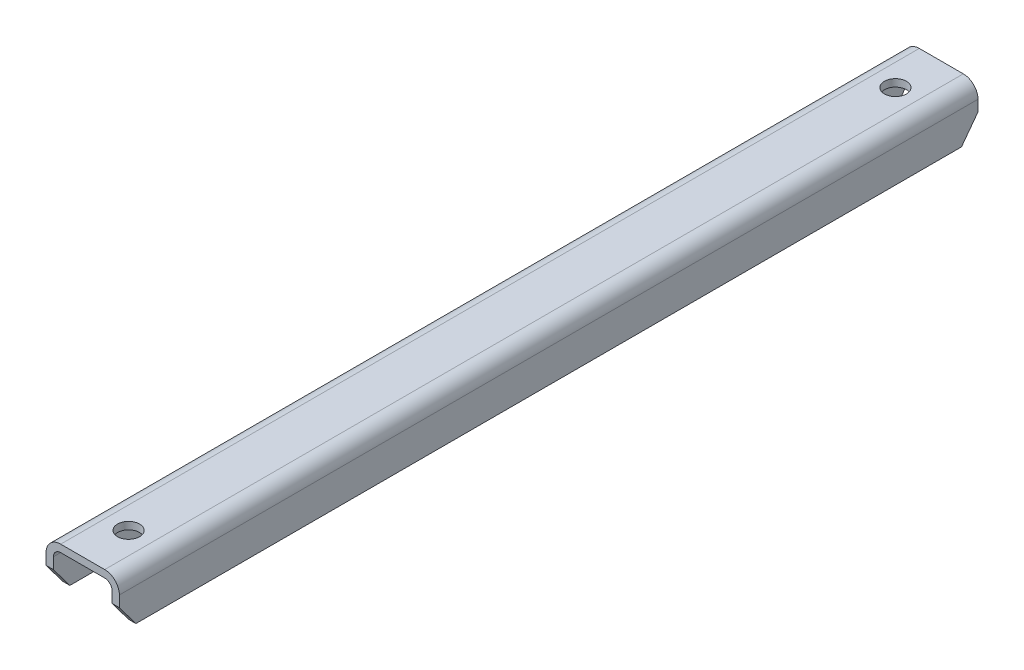
ISO-10303-21;
HEADER;
FILE_DESCRIPTION(('STEP AP214'),'2;1');
FILE_NAME('part.step','',(''),(''),'','','');
FILE_SCHEMA(('AUTOMOTIVE_DESIGN { 1 0 10303 214 1 1 1 1 }'));
ENDSEC;
DATA;
#1=APPLICATION_CONTEXT('core data for automotive mechanical design processes');
#2=APPLICATION_PROTOCOL_DEFINITION('international standard','automotive_design',2000,#1);
#3=PRODUCT_CONTEXT('',#1,'mechanical');
#4=PRODUCT('Part','Part','',(#3));
#5=PRODUCT_RELATED_PRODUCT_CATEGORY('part','',(#4));
#6=PRODUCT_DEFINITION_FORMATION('','',#4);
#7=PRODUCT_DEFINITION_CONTEXT('part definition',#1,'design');
#8=PRODUCT_DEFINITION('design','',#6,#7);
#9=PRODUCT_DEFINITION_SHAPE('','',#8);
#10=(LENGTH_UNIT() NAMED_UNIT(*) SI_UNIT(.MILLI.,.METRE.));
#11=(NAMED_UNIT(*) PLANE_ANGLE_UNIT() SI_UNIT($,.RADIAN.));
#12=(NAMED_UNIT(*) SI_UNIT($,.STERADIAN.) SOLID_ANGLE_UNIT());
#13=UNCERTAINTY_MEASURE_WITH_UNIT(LENGTH_MEASURE(1.E-05),#10,'distance_accuracy_value','');
#14=(GEOMETRIC_REPRESENTATION_CONTEXT(3) GLOBAL_UNCERTAINTY_ASSIGNED_CONTEXT((#13)) GLOBAL_UNIT_ASSIGNED_CONTEXT((#10,
#11,#12)) REPRESENTATION_CONTEXT('',''));
#15=CARTESIAN_POINT('',(0.,0.,0.));
#16=DIRECTION('',(0.,0.,1.));
#17=DIRECTION('',(1.,0.,0.));
#18=AXIS2_PLACEMENT_3D('',#15,#16,#17);
#19=CARTESIAN_POINT('',(-40.,-65.,585.));
#20=DIRECTION('',(0.,1.,0.));
#21=DIRECTION('',(0.,0.,1.));
#22=AXIS2_PLACEMENT_3D('',#19,#20,#21);
#23=PLANE('',#22);
#24=DIRECTION('',(0.,0.,-1.));
#25=VECTOR('',#24,1.);
#26=CARTESIAN_POINT('',(-50.,-65.,585.));
#27=LINE('',#26,#25);
#28=CARTESIAN_POINT('',(-50.,-65.,562.5));
#29=VERTEX_POINT('',#28);
#30=CARTESIAN_POINT('',(-50.,-64.9999999999999,-562.5));
#31=VERTEX_POINT('',#30);
#32=EDGE_CURVE('E196',#29,#31,#27,.T.);
#33=ORIENTED_EDGE('',*,*,#32,.T.);
#34=DIRECTION('',(1.,0.,0.));
#35=VECTOR('',#34,1.);
#36=CARTESIAN_POINT('',(-350.,-64.9999999999999,-562.5));
#37=LINE('',#36,#35);
#38=CARTESIAN_POINT('',(-40.,-64.9999999999999,-562.5));
#39=VERTEX_POINT('',#38);
#40=EDGE_CURVE('E301',#31,#39,#37,.T.);
#41=ORIENTED_EDGE('',*,*,#40,.T.);
#42=DIRECTION('',(0.,0.,-1.));
#43=VECTOR('',#42,1.);
#44=CARTESIAN_POINT('',(-40.,-65.,585.));
#45=LINE('',#44,#43);
#46=CARTESIAN_POINT('',(-40.,-65.,562.5));
#47=VERTEX_POINT('',#46);
#48=EDGE_CURVE('E161',#47,#39,#45,.T.);
#49=ORIENTED_EDGE('',*,*,#48,.F.);
#50=DIRECTION('',(1.,0.,0.));
#51=VECTOR('',#50,1.);
#52=CARTESIAN_POINT('',(-350.,-65.,562.5));
#53=LINE('',#52,#51);
#54=EDGE_CURVE('E273',#29,#47,#53,.T.);
#55=ORIENTED_EDGE('',*,*,#54,.F.);
#56=EDGE_LOOP('',(#33,#41,#49,#55));
#57=FACE_BOUND('',#56,.T.);
#58=ADVANCED_FACE('F36',(#57),#23,.F.);
#59=CARTESIAN_POINT('',(-40.,-20.0000000000001,585.));
#60=DIRECTION('',(-1.,0.,0.));
#61=DIRECTION('',(0.,0.,1.));
#62=AXIS2_PLACEMENT_3D('',#59,#60,#61);
#63=PLANE('',#62);
#64=ORIENTED_EDGE('',*,*,#48,.T.);
#65=DIRECTION('',(0.,0.800000000000001,-0.599999999999999));
#66=VECTOR('',#65,1.);
#67=CARTESIAN_POINT('',(-40.,-587.,-171.000000000001));
#68=LINE('',#67,#66);
#69=CARTESIAN_POINT('',(-40.,-34.9999999999999,-585.));
#70=VERTEX_POINT('',#69);
#71=EDGE_CURVE('E146',#39,#70,#68,.T.);
#72=ORIENTED_EDGE('',*,*,#71,.T.);
#73=DIRECTION('',(0.,1.,0.));
#74=VECTOR('',#73,1.);
#75=CARTESIAN_POINT('',(-40.,-20.0000000000001,-585.));
#76=LINE('',#75,#74);
#77=CARTESIAN_POINT('',(-40.,-20.0000000000001,-585.));
#78=VERTEX_POINT('',#77);
#79=EDGE_CURVE('E157',#70,#78,#76,.T.);
#80=ORIENTED_EDGE('',*,*,#79,.T.);
#81=DIRECTION('',(0.,0.,-1.));
#82=VECTOR('',#81,1.);
#83=CARTESIAN_POINT('',(-40.,-20.0000000000001,585.));
#84=LINE('',#83,#82);
#85=CARTESIAN_POINT('',(-40.,-20.0000000000001,585.));
#86=VERTEX_POINT('',#85);
#87=EDGE_CURVE('E226',#86,#78,#84,.T.);
#88=ORIENTED_EDGE('',*,*,#87,.F.);
#89=DIRECTION('',(0.,1.,0.));
#90=VECTOR('',#89,1.);
#91=CARTESIAN_POINT('',(-40.,-20.0000000000001,585.));
#92=LINE('',#91,#90);
#93=CARTESIAN_POINT('',(-40.,-35.,585.));
#94=VERTEX_POINT('',#93);
#95=EDGE_CURVE('E195',#94,#86,#92,.T.);
#96=ORIENTED_EDGE('',*,*,#95,.F.);
#97=DIRECTION('',(0.,-0.800000000000001,-0.6));
#98=VECTOR('',#97,1.);
#99=CARTESIAN_POINT('',(-40.,-25.4000000000001,592.2));
#100=LINE('',#99,#98);
#101=EDGE_CURVE('E169',#94,#47,#100,.T.);
#102=ORIENTED_EDGE('',*,*,#101,.T.);
#103=EDGE_LOOP('',(#64,#72,#80,#88,#96,#102));
#104=FACE_BOUND('',#103,.T.);
#105=ADVANCED_FACE('F155',(#104),#63,.F.);
#106=CARTESIAN_POINT('',(-30.,-20.,585.));
#107=DIRECTION('',(0.,0.,-1.));
#108=DIRECTION('',(-1.,0.,0.));
#109=AXIS2_PLACEMENT_3D('',#106,#107,#108);
#110=CYLINDRICAL_SURFACE('',#109,9.99999999999999);
#111=CARTESIAN_POINT('',(-30.,-20.,-585.));
#112=DIRECTION('',(0.,0.,-1.));
#113=DIRECTION('',(1.,0.,0.));
#114=AXIS2_PLACEMENT_3D('',#111,#112,#113);
#115=CIRCLE('',#114,9.99999999999999);
#116=CARTESIAN_POINT('',(-29.9999999999999,-10.,-585.));
#117=VERTEX_POINT('',#116);
#118=EDGE_CURVE('E168',#78,#117,#115,.T.);
#119=ORIENTED_EDGE('',*,*,#118,.T.);
#120=DIRECTION('',(0.,0.,-1.));
#121=VECTOR('',#120,1.);
#122=CARTESIAN_POINT('',(-29.9999999999999,-10.,585.));
#123=LINE('',#122,#121);
#124=CARTESIAN_POINT('',(-29.9999999999999,-10.,585.));
#125=VERTEX_POINT('',#124);
#126=EDGE_CURVE('E223',#125,#117,#123,.T.);
#127=ORIENTED_EDGE('',*,*,#126,.F.);
#128=CARTESIAN_POINT('',(-30.,-20.,585.));
#129=DIRECTION('',(0.,0.,-1.));
#130=DIRECTION('',(1.,0.,0.));
#131=AXIS2_PLACEMENT_3D('',#128,#129,#130);
#132=CIRCLE('',#131,9.99999999999999);
#133=EDGE_CURVE('E279',#86,#125,#132,.T.);
#134=ORIENTED_EDGE('',*,*,#133,.F.);
#135=ORIENTED_EDGE('',*,*,#87,.T.);
#136=EDGE_LOOP('',(#119,#127,#134,#135));
#137=FACE_BOUND('',#136,.T.);
#138=ADVANCED_FACE('F339',(#137),#110,.F.);
#139=CARTESIAN_POINT('',(-29.9999999999999,-10.,585.));
#140=DIRECTION('',(0.,1.,0.));
#141=DIRECTION('',(0.,0.,1.));
#142=AXIS2_PLACEMENT_3D('',#139,#140,#141);
#143=PLANE('',#142);
#144=CARTESIAN_POINT('',(0.,-10.,522.5));
#145=DIRECTION('',(0.,1.,0.));
#146=DIRECTION('',(0.,0.,1.));
#147=AXIS2_PLACEMENT_3D('',#144,#145,#146);
#148=CIRCLE('',#147,15.);
#149=CARTESIAN_POINT('',(0.,-10.,537.5));
#150=VERTEX_POINT('',#149);
#151=EDGE_CURVE('E312',#150,#150,#148,.T.);
#152=ORIENTED_EDGE('',*,*,#151,.T.);
#153=EDGE_LOOP('',(#152));
#154=FACE_BOUND('',#153,.T.);
#155=CARTESIAN_POINT('',(0.,-10.,-522.5));
#156=DIRECTION('',(0.,1.,0.));
#157=DIRECTION('',(0.,0.,1.));
#158=AXIS2_PLACEMENT_3D('',#155,#156,#157);
#159=CIRCLE('',#158,15.);
#160=CARTESIAN_POINT('',(0.,-10.,-507.5));
#161=VERTEX_POINT('',#160);
#162=EDGE_CURVE('E306',#161,#161,#159,.T.);
#163=ORIENTED_EDGE('',*,*,#162,.T.);
#164=EDGE_LOOP('',(#163));
#165=FACE_BOUND('',#164,.T.);
#166=DIRECTION('',(1.,0.,0.));
#167=VECTOR('',#166,1.);
#168=CARTESIAN_POINT('',(-29.9999999999999,-10.,-585.));
#169=LINE('',#168,#167);
#170=CARTESIAN_POINT('',(29.9999999999999,-10.,-585.));
#171=VERTEX_POINT('',#170);
#172=EDGE_CURVE('E171',#117,#171,#169,.T.);
#173=ORIENTED_EDGE('',*,*,#172,.T.);
#174=DIRECTION('',(0.,0.,-1.));
#175=VECTOR('',#174,1.);
#176=CARTESIAN_POINT('',(29.9999999999999,-10.,585.));
#177=LINE('',#176,#175);
#178=CARTESIAN_POINT('',(29.9999999999999,-10.,585.));
#179=VERTEX_POINT('',#178);
#180=EDGE_CURVE('E220',#179,#171,#177,.T.);
#181=ORIENTED_EDGE('',*,*,#180,.F.);
#182=DIRECTION('',(1.,0.,0.));
#183=VECTOR('',#182,1.);
#184=CARTESIAN_POINT('',(-29.9999999999999,-10.,585.));
#185=LINE('',#184,#183);
#186=EDGE_CURVE('E256',#125,#179,#185,.T.);
#187=ORIENTED_EDGE('',*,*,#186,.F.);
#188=ORIENTED_EDGE('',*,*,#126,.T.);
#189=EDGE_LOOP('',(#173,#181,#187,#188));
#190=FACE_BOUND('',#189,.T.);
#191=ADVANCED_FACE('F285',(#154,#165,#190),#143,.F.);
#192=CARTESIAN_POINT('',(30.,-20.,585.));
#193=DIRECTION('',(0.,0.,-1.));
#194=DIRECTION('',(-1.,0.,0.));
#195=AXIS2_PLACEMENT_3D('',#192,#193,#194);
#196=CYLINDRICAL_SURFACE('',#195,10.);
#197=CARTESIAN_POINT('',(30.,-20.,-585.));
#198=DIRECTION('',(0.,0.,-1.));
#199=DIRECTION('',(-1.,0.,0.));
#200=AXIS2_PLACEMENT_3D('',#197,#198,#199);
#201=CIRCLE('',#200,10.);
#202=CARTESIAN_POINT('',(40.,-20.0000000000001,-585.));
#203=VERTEX_POINT('',#202);
#204=EDGE_CURVE('E180',#171,#203,#201,.T.);
#205=ORIENTED_EDGE('',*,*,#204,.T.);
#206=DIRECTION('',(0.,0.,-1.));
#207=VECTOR('',#206,1.);
#208=CARTESIAN_POINT('',(40.,-20.0000000000001,585.));
#209=LINE('',#208,#207);
#210=CARTESIAN_POINT('',(40.,-20.0000000000001,585.));
#211=VERTEX_POINT('',#210);
#212=EDGE_CURVE('E217',#211,#203,#209,.T.);
#213=ORIENTED_EDGE('',*,*,#212,.F.);
#214=CARTESIAN_POINT('',(30.,-20.,585.));
#215=DIRECTION('',(0.,0.,-1.));
#216=DIRECTION('',(-1.,0.,0.));
#217=AXIS2_PLACEMENT_3D('',#214,#215,#216);
#218=CIRCLE('',#217,10.);
#219=EDGE_CURVE('E250',#179,#211,#218,.T.);
#220=ORIENTED_EDGE('',*,*,#219,.F.);
#221=ORIENTED_EDGE('',*,*,#180,.T.);
#222=EDGE_LOOP('',(#205,#213,#220,#221));
#223=FACE_BOUND('',#222,.T.);
#224=ADVANCED_FACE('F288',(#223),#196,.F.);
#225=CARTESIAN_POINT('',(40.,-20.0000000000001,585.));
#226=DIRECTION('',(1.,0.,0.));
#227=DIRECTION('',(0.,0.,-1.));
#228=AXIS2_PLACEMENT_3D('',#225,#226,#227);
#229=PLANE('',#228);
#230=DIRECTION('',(0.,-1.,0.));
#231=VECTOR('',#230,1.);
#232=CARTESIAN_POINT('',(40.,-20.0000000000001,-585.));
#233=LINE('',#232,#231);
#234=CARTESIAN_POINT('',(40.,-34.9999999999999,-585.));
#235=VERTEX_POINT('',#234);
#236=EDGE_CURVE('E182',#203,#235,#233,.T.);
#237=ORIENTED_EDGE('',*,*,#236,.T.);
#238=DIRECTION('',(0.,-0.800000000000001,0.599999999999999));
#239=VECTOR('',#238,1.);
#240=CARTESIAN_POINT('',(40.,-587.,-171.000000000001));
#241=LINE('',#240,#239);
#242=CARTESIAN_POINT('',(40.,-64.9999999999999,-562.5));
#243=VERTEX_POINT('',#242);
#244=EDGE_CURVE('E50',#235,#243,#241,.T.);
#245=ORIENTED_EDGE('',*,*,#244,.T.);
#246=DIRECTION('',(0.,0.,-1.));
#247=VECTOR('',#246,1.);
#248=CARTESIAN_POINT('',(40.,-65.,585.));
#249=LINE('',#248,#247);
#250=CARTESIAN_POINT('',(40.,-65.,562.5));
#251=VERTEX_POINT('',#250);
#252=EDGE_CURVE('E214',#251,#243,#249,.T.);
#253=ORIENTED_EDGE('',*,*,#252,.F.);
#254=DIRECTION('',(0.,0.800000000000001,0.6));
#255=VECTOR('',#254,1.);
#256=CARTESIAN_POINT('',(40.,-25.4,592.2));
#257=LINE('',#256,#255);
#258=CARTESIAN_POINT('',(40.,-35.,585.));
#259=VERTEX_POINT('',#258);
#260=EDGE_CURVE('E173',#251,#259,#257,.T.);
#261=ORIENTED_EDGE('',*,*,#260,.T.);
#262=DIRECTION('',(0.,-1.,0.));
#263=VECTOR('',#262,1.);
#264=CARTESIAN_POINT('',(40.,-20.0000000000001,585.));
#265=LINE('',#264,#263);
#266=EDGE_CURVE('E246',#211,#259,#265,.T.);
#267=ORIENTED_EDGE('',*,*,#266,.F.);
#268=ORIENTED_EDGE('',*,*,#212,.T.);
#269=EDGE_LOOP('',(#237,#245,#253,#261,#267,#268));
#270=FACE_BOUND('',#269,.T.);
#271=ADVANCED_FACE('F245',(#270),#229,.F.);
#272=CARTESIAN_POINT('',(40.,-65.,585.));
#273=DIRECTION('',(0.,1.,0.));
#274=DIRECTION('',(0.,0.,1.));
#275=AXIS2_PLACEMENT_3D('',#272,#273,#274);
#276=PLANE('',#275);
#277=ORIENTED_EDGE('',*,*,#252,.T.);
#278=CARTESIAN_POINT('',(50.,-64.9999999999999,-562.5));
#279=VERTEX_POINT('',#278);
#280=EDGE_CURVE('E304',#243,#279,#37,.T.);
#281=ORIENTED_EDGE('',*,*,#280,.T.);
#282=DIRECTION('',(0.,0.,-1.));
#283=VECTOR('',#282,1.);
#284=CARTESIAN_POINT('',(50.,-65.,585.));
#285=LINE('',#284,#283);
#286=CARTESIAN_POINT('',(50.,-65.,562.5));
#287=VERTEX_POINT('',#286);
#288=EDGE_CURVE('E211',#287,#279,#285,.T.);
#289=ORIENTED_EDGE('',*,*,#288,.F.);
#290=EDGE_CURVE('E162',#251,#287,#53,.T.);
#291=ORIENTED_EDGE('',*,*,#290,.F.);
#292=EDGE_LOOP('',(#277,#281,#289,#291));
#293=FACE_BOUND('',#292,.T.);
#294=ADVANCED_FACE('F368',(#293),#276,.F.);
#295=CARTESIAN_POINT('',(50.,-20.0000000000001,585.));
#296=DIRECTION('',(-1.,0.,0.));
#297=DIRECTION('',(0.,-1.,0.));
#298=AXIS2_PLACEMENT_3D('',#295,#296,#297);
#299=PLANE('',#298);
#300=ORIENTED_EDGE('',*,*,#288,.T.);
#301=DIRECTION('',(0.,0.800000000000001,-0.599999999999999));
#302=VECTOR('',#301,1.);
#303=CARTESIAN_POINT('',(49.9999999999999,-587.,-171.000000000001));
#304=LINE('',#303,#302);
#305=CARTESIAN_POINT('',(50.,-34.9999999999999,-585.));
#306=VERTEX_POINT('',#305);
#307=EDGE_CURVE('E293',#279,#306,#304,.T.);
#308=ORIENTED_EDGE('',*,*,#307,.T.);
#309=DIRECTION('',(0.,1.,0.));
#310=VECTOR('',#309,1.);
#311=CARTESIAN_POINT('',(50.,-20.0000000000001,-585.));
#312=LINE('',#311,#310);
#313=CARTESIAN_POINT('',(50.,-20.0000000000001,-585.));
#314=VERTEX_POINT('',#313);
#315=EDGE_CURVE('E185',#306,#314,#312,.T.);
#316=ORIENTED_EDGE('',*,*,#315,.T.);
#317=DIRECTION('',(0.,0.,-1.));
#318=VECTOR('',#317,1.);
#319=CARTESIAN_POINT('',(50.,-20.0000000000001,585.));
#320=LINE('',#319,#318);
#321=CARTESIAN_POINT('',(50.,-20.0000000000001,585.));
#322=VERTEX_POINT('',#321);
#323=EDGE_CURVE('E208',#322,#314,#320,.T.);
#324=ORIENTED_EDGE('',*,*,#323,.F.);
#325=DIRECTION('',(0.,1.,0.));
#326=VECTOR('',#325,1.);
#327=CARTESIAN_POINT('',(50.,-20.0000000000001,585.));
#328=LINE('',#327,#326);
#329=CARTESIAN_POINT('',(50.,-35.,585.));
#330=VERTEX_POINT('',#329);
#331=EDGE_CURVE('E252',#330,#322,#328,.T.);
#332=ORIENTED_EDGE('',*,*,#331,.F.);
#333=DIRECTION('',(0.,-0.800000000000001,-0.6));
#334=VECTOR('',#333,1.);
#335=CARTESIAN_POINT('',(50.,-25.4000000000001,592.2));
#336=LINE('',#335,#334);
#337=EDGE_CURVE('E238',#330,#287,#336,.T.);
#338=ORIENTED_EDGE('',*,*,#337,.T.);
#339=EDGE_LOOP('',(#300,#308,#316,#324,#332,#338));
#340=FACE_BOUND('',#339,.T.);
#341=ADVANCED_FACE('F296',(#340),#299,.F.);
#342=CARTESIAN_POINT('',(30.,-20.,585.));
#343=DIRECTION('',(0.,0.,-1.));
#344=DIRECTION('',(-1.,0.,0.));
#345=AXIS2_PLACEMENT_3D('',#342,#343,#344);
#346=CYLINDRICAL_SURFACE('',#345,20.);
#347=CARTESIAN_POINT('',(30.,-20.,-585.));
#348=DIRECTION('',(0.,0.,1.));
#349=DIRECTION('',(-1.,0.,0.));
#350=AXIS2_PLACEMENT_3D('',#347,#348,#349);
#351=CIRCLE('',#350,20.);
#352=CARTESIAN_POINT('',(29.9999999999999,0.,-585.));
#353=VERTEX_POINT('',#352);
#354=EDGE_CURVE('E187',#314,#353,#351,.T.);
#355=ORIENTED_EDGE('',*,*,#354,.T.);
#356=DIRECTION('',(0.,0.,-1.));
#357=VECTOR('',#356,1.);
#358=CARTESIAN_POINT('',(29.9999999999999,0.,585.));
#359=LINE('',#358,#357);
#360=CARTESIAN_POINT('',(29.9999999999999,0.,585.));
#361=VERTEX_POINT('',#360);
#362=EDGE_CURVE('E205',#361,#353,#359,.T.);
#363=ORIENTED_EDGE('',*,*,#362,.F.);
#364=CARTESIAN_POINT('',(30.,-20.,585.));
#365=DIRECTION('',(0.,0.,1.));
#366=DIRECTION('',(-1.,0.,0.));
#367=AXIS2_PLACEMENT_3D('',#364,#365,#366);
#368=CIRCLE('',#367,20.);
#369=EDGE_CURVE('E254',#322,#361,#368,.T.);
#370=ORIENTED_EDGE('',*,*,#369,.F.);
#371=ORIENTED_EDGE('',*,*,#323,.T.);
#372=EDGE_LOOP('',(#355,#363,#370,#371));
#373=FACE_BOUND('',#372,.T.);
#374=ADVANCED_FACE('F326',(#373),#346,.T.);
#375=CARTESIAN_POINT('',(-29.9999999999999,0.,585.));
#376=DIRECTION('',(0.,-1.,0.));
#377=DIRECTION('',(0.,0.,-1.));
#378=AXIS2_PLACEMENT_3D('',#375,#376,#377);
#379=PLANE('',#378);
#380=CARTESIAN_POINT('',(0.,0.,522.5));
#381=DIRECTION('',(0.,1.,0.));
#382=DIRECTION('',(0.,0.,1.));
#383=AXIS2_PLACEMENT_3D('',#380,#381,#382);
#384=CIRCLE('',#383,15.);
#385=CARTESIAN_POINT('',(0.,0.,537.5));
#386=VERTEX_POINT('',#385);
#387=EDGE_CURVE('E315',#386,#386,#384,.T.);
#388=ORIENTED_EDGE('',*,*,#387,.F.);
#389=EDGE_LOOP('',(#388));
#390=FACE_BOUND('',#389,.T.);
#391=CARTESIAN_POINT('',(0.,0.,-522.5));
#392=DIRECTION('',(0.,1.,0.));
#393=DIRECTION('',(0.,0.,1.));
#394=AXIS2_PLACEMENT_3D('',#391,#392,#393);
#395=CIRCLE('',#394,15.);
#396=CARTESIAN_POINT('',(0.,0.,-507.5));
#397=VERTEX_POINT('',#396);
#398=EDGE_CURVE('E309',#397,#397,#395,.T.);
#399=ORIENTED_EDGE('',*,*,#398,.F.);
#400=EDGE_LOOP('',(#399));
#401=FACE_BOUND('',#400,.T.);
#402=DIRECTION('',(-1.,0.,0.));
#403=VECTOR('',#402,1.);
#404=CARTESIAN_POINT('',(-29.9999999999999,0.,-585.));
#405=LINE('',#404,#403);
#406=CARTESIAN_POINT('',(-29.9999999999999,0.,-585.));
#407=VERTEX_POINT('',#406);
#408=EDGE_CURVE('E189',#353,#407,#405,.T.);
#409=ORIENTED_EDGE('',*,*,#408,.T.);
#410=DIRECTION('',(0.,0.,-1.));
#411=VECTOR('',#410,1.);
#412=CARTESIAN_POINT('',(-29.9999999999999,0.,585.));
#413=LINE('',#412,#411);
#414=CARTESIAN_POINT('',(-29.9999999999999,0.,585.));
#415=VERTEX_POINT('',#414);
#416=EDGE_CURVE('E202',#415,#407,#413,.T.);
#417=ORIENTED_EDGE('',*,*,#416,.F.);
#418=DIRECTION('',(-1.,0.,0.));
#419=VECTOR('',#418,1.);
#420=CARTESIAN_POINT('',(-29.9999999999999,0.,585.));
#421=LINE('',#420,#419);
#422=EDGE_CURVE('E261',#361,#415,#421,.T.);
#423=ORIENTED_EDGE('',*,*,#422,.F.);
#424=ORIENTED_EDGE('',*,*,#362,.T.);
#425=EDGE_LOOP('',(#409,#417,#423,#424));
#426=FACE_BOUND('',#425,.T.);
#427=ADVANCED_FACE('F322',(#390,#401,#426),#379,.F.);
#428=CARTESIAN_POINT('',(-30.,-20.,585.));
#429=DIRECTION('',(0.,0.,-1.));
#430=DIRECTION('',(-1.,0.,0.));
#431=AXIS2_PLACEMENT_3D('',#428,#429,#430);
#432=CYLINDRICAL_SURFACE('',#431,20.);
#433=CARTESIAN_POINT('',(-30.,-20.,-585.));
#434=DIRECTION('',(0.,0.,1.));
#435=DIRECTION('',(1.,0.,0.));
#436=AXIS2_PLACEMENT_3D('',#433,#434,#435);
#437=CIRCLE('',#436,20.);
#438=CARTESIAN_POINT('',(-50.,-20.0000000000001,-585.));
#439=VERTEX_POINT('',#438);
#440=EDGE_CURVE('E191',#407,#439,#437,.T.);
#441=ORIENTED_EDGE('',*,*,#440,.T.);
#442=DIRECTION('',(0.,0.,-1.));
#443=VECTOR('',#442,1.);
#444=CARTESIAN_POINT('',(-50.,-20.0000000000001,585.));
#445=LINE('',#444,#443);
#446=CARTESIAN_POINT('',(-50.,-20.0000000000001,585.));
#447=VERTEX_POINT('',#446);
#448=EDGE_CURVE('E199',#447,#439,#445,.T.);
#449=ORIENTED_EDGE('',*,*,#448,.F.);
#450=CARTESIAN_POINT('',(-30.,-20.,585.));
#451=DIRECTION('',(0.,0.,1.));
#452=DIRECTION('',(1.,0.,0.));
#453=AXIS2_PLACEMENT_3D('',#450,#451,#452);
#454=CIRCLE('',#453,20.);
#455=EDGE_CURVE('E262',#415,#447,#454,.T.);
#456=ORIENTED_EDGE('',*,*,#455,.F.);
#457=ORIENTED_EDGE('',*,*,#416,.T.);
#458=EDGE_LOOP('',(#441,#449,#456,#457));
#459=FACE_BOUND('',#458,.T.);
#460=ADVANCED_FACE('F325',(#459),#432,.T.);
#461=CARTESIAN_POINT('',(-50.,-20.0000000000001,585.));
#462=DIRECTION('',(1.,0.,0.));
#463=DIRECTION('',(0.,1.,0.));
#464=AXIS2_PLACEMENT_3D('',#461,#462,#463);
#465=PLANE('',#464);
#466=DIRECTION('',(0.,-1.,0.));
#467=VECTOR('',#466,1.);
#468=CARTESIAN_POINT('',(-50.,-20.0000000000001,-585.));
#469=LINE('',#468,#467);
#470=CARTESIAN_POINT('',(-50.,-34.9999999999999,-585.));
#471=VERTEX_POINT('',#470);
#472=EDGE_CURVE('E193',#439,#471,#469,.T.);
#473=ORIENTED_EDGE('',*,*,#472,.T.);
#474=DIRECTION('',(0.,-0.800000000000001,0.599999999999999));
#475=VECTOR('',#474,1.);
#476=CARTESIAN_POINT('',(-49.9999999999999,-587.,-171.000000000001));
#477=LINE('',#476,#475);
#478=EDGE_CURVE('E57',#471,#31,#477,.T.);
#479=ORIENTED_EDGE('',*,*,#478,.T.);
#480=ORIENTED_EDGE('',*,*,#32,.F.);
#481=DIRECTION('',(0.,0.800000000000001,0.6));
#482=VECTOR('',#481,1.);
#483=CARTESIAN_POINT('',(-50.,-25.4000000000001,592.2));
#484=LINE('',#483,#482);
#485=CARTESIAN_POINT('',(-50.,-35.,585.));
#486=VERTEX_POINT('',#485);
#487=EDGE_CURVE('E271',#29,#486,#484,.T.);
#488=ORIENTED_EDGE('',*,*,#487,.T.);
#489=DIRECTION('',(0.,-1.,0.));
#490=VECTOR('',#489,1.);
#491=CARTESIAN_POINT('',(-50.,-20.0000000000001,585.));
#492=LINE('',#491,#490);
#493=EDGE_CURVE('E176',#447,#486,#492,.T.);
#494=ORIENTED_EDGE('',*,*,#493,.F.);
#495=ORIENTED_EDGE('',*,*,#448,.T.);
#496=EDGE_LOOP('',(#473,#479,#480,#488,#494,#495));
#497=FACE_BOUND('',#496,.T.);
#498=ADVANCED_FACE('F269',(#497),#465,.F.);
#499=CARTESIAN_POINT('',(-30.,-20.,585.));
#500=DIRECTION('',(0.,0.,1.));
#501=DIRECTION('',(1.,0.,0.));
#502=AXIS2_PLACEMENT_3D('',#499,#500,#501);
#503=PLANE('',#502);
#504=DIRECTION('',(-1.,0.,0.));
#505=VECTOR('',#504,1.);
#506=CARTESIAN_POINT('',(-30.,-35.,585.));
#507=LINE('',#506,#505);
#508=EDGE_CURVE('E152',#330,#259,#507,.T.);
#509=ORIENTED_EDGE('',*,*,#508,.F.);
#510=ORIENTED_EDGE('',*,*,#331,.T.);
#511=ORIENTED_EDGE('',*,*,#369,.T.);
#512=ORIENTED_EDGE('',*,*,#422,.T.);
#513=ORIENTED_EDGE('',*,*,#455,.T.);
#514=ORIENTED_EDGE('',*,*,#493,.T.);
#515=EDGE_CURVE('E228',#94,#486,#507,.T.);
#516=ORIENTED_EDGE('',*,*,#515,.F.);
#517=ORIENTED_EDGE('',*,*,#95,.T.);
#518=ORIENTED_EDGE('',*,*,#133,.T.);
#519=ORIENTED_EDGE('',*,*,#186,.T.);
#520=ORIENTED_EDGE('',*,*,#219,.T.);
#521=ORIENTED_EDGE('',*,*,#266,.T.);
#522=EDGE_LOOP('',(#509,#510,#511,#512,#513,#514,#516,#517,#518,#519,#520,#521));
#523=FACE_BOUND('',#522,.T.);
#524=ADVANCED_FACE('F248',(#523),#503,.T.);
#525=CARTESIAN_POINT('',(-30.,-20.,-585.));
#526=DIRECTION('',(0.,0.,1.));
#527=DIRECTION('',(1.,0.,0.));
#528=AXIS2_PLACEMENT_3D('',#525,#526,#527);
#529=PLANE('',#528);
#530=ORIENTED_EDGE('',*,*,#315,.F.);
#531=DIRECTION('',(-1.,0.,0.));
#532=VECTOR('',#531,1.);
#533=CARTESIAN_POINT('',(-30.,-34.9999999999999,-585.));
#534=LINE('',#533,#532);
#535=EDGE_CURVE('E11',#306,#235,#534,.T.);
#536=ORIENTED_EDGE('',*,*,#535,.T.);
#537=ORIENTED_EDGE('',*,*,#236,.F.);
#538=ORIENTED_EDGE('',*,*,#204,.F.);
#539=ORIENTED_EDGE('',*,*,#172,.F.);
#540=ORIENTED_EDGE('',*,*,#118,.F.);
#541=ORIENTED_EDGE('',*,*,#79,.F.);
#542=EDGE_CURVE('E39',#70,#471,#534,.T.);
#543=ORIENTED_EDGE('',*,*,#542,.T.);
#544=ORIENTED_EDGE('',*,*,#472,.F.);
#545=ORIENTED_EDGE('',*,*,#440,.F.);
#546=ORIENTED_EDGE('',*,*,#408,.F.);
#547=ORIENTED_EDGE('',*,*,#354,.F.);
#548=EDGE_LOOP('',(#530,#536,#537,#538,#539,#540,#541,#543,#544,#545,#546,#547));
#549=FACE_BOUND('',#548,.T.);
#550=ADVANCED_FACE('F166',(#549),#529,.F.);
#551=CARTESIAN_POINT('',(-350.,-65.,562.5));
#552=DIRECTION('',(0.,0.599999999999999,-0.8));
#553=DIRECTION('',(0.,0.800000000000001,0.6));
#554=AXIS2_PLACEMENT_3D('',#551,#552,#553);
#555=PLANE('',#554);
#556=ORIENTED_EDGE('',*,*,#515,.T.);
#557=ORIENTED_EDGE('',*,*,#487,.F.);
#558=ORIENTED_EDGE('',*,*,#54,.T.);
#559=ORIENTED_EDGE('',*,*,#101,.F.);
#560=EDGE_LOOP('',(#556,#557,#558,#559));
#561=FACE_BOUND('',#560,.T.);
#562=ADVANCED_FACE('F337',(#561),#555,.F.);
#563=ORIENTED_EDGE('',*,*,#290,.T.);
#564=ORIENTED_EDGE('',*,*,#337,.F.);
#565=ORIENTED_EDGE('',*,*,#508,.T.);
#566=ORIENTED_EDGE('',*,*,#260,.F.);
#567=EDGE_LOOP('',(#563,#564,#565,#566));
#568=FACE_BOUND('',#567,.T.);
#569=ADVANCED_FACE('F235',(#568),#555,.F.);
#570=CARTESIAN_POINT('',(-350.,-64.9999999999999,-562.5));
#571=DIRECTION('',(0.,0.599999999999999,0.8));
#572=DIRECTION('',(0.,-0.800000000000001,0.599999999999999));
#573=AXIS2_PLACEMENT_3D('',#570,#571,#572);
#574=PLANE('',#573);
#575=ORIENTED_EDGE('',*,*,#40,.F.);
#576=ORIENTED_EDGE('',*,*,#478,.F.);
#577=ORIENTED_EDGE('',*,*,#542,.F.);
#578=ORIENTED_EDGE('',*,*,#71,.F.);
#579=EDGE_LOOP('',(#575,#576,#577,#578));
#580=FACE_BOUND('',#579,.T.);
#581=ADVANCED_FACE('F145',(#580),#574,.F.);
#582=ORIENTED_EDGE('',*,*,#535,.F.);
#583=ORIENTED_EDGE('',*,*,#307,.F.);
#584=ORIENTED_EDGE('',*,*,#280,.F.);
#585=ORIENTED_EDGE('',*,*,#244,.F.);
#586=EDGE_LOOP('',(#582,#583,#584,#585));
#587=FACE_BOUND('',#586,.T.);
#588=ADVANCED_FACE('F292',(#587),#574,.F.);
#589=CARTESIAN_POINT('',(0.,-65.,-522.5));
#590=DIRECTION('',(0.,1.,0.));
#591=DIRECTION('',(0.,0.,1.));
#592=AXIS2_PLACEMENT_3D('',#589,#590,#591);
#593=CYLINDRICAL_SURFACE('',#592,15.);
#594=ORIENTED_EDGE('',*,*,#398,.T.);
#595=EDGE_LOOP('',(#594));
#596=FACE_BOUND('',#595,.T.);
#597=ORIENTED_EDGE('',*,*,#162,.F.);
#598=EDGE_LOOP('',(#597));
#599=FACE_BOUND('',#598,.T.);
#600=ADVANCED_FACE('F457',(#596,#599),#593,.F.);
#601=CARTESIAN_POINT('',(0.,-65.,522.5));
#602=DIRECTION('',(0.,1.,0.));
#603=DIRECTION('',(0.,0.,1.));
#604=AXIS2_PLACEMENT_3D('',#601,#602,#603);
#605=CYLINDRICAL_SURFACE('',#604,15.);
#606=ORIENTED_EDGE('',*,*,#387,.T.);
#607=EDGE_LOOP('',(#606));
#608=FACE_BOUND('',#607,.T.);
#609=ORIENTED_EDGE('',*,*,#151,.F.);
#610=EDGE_LOOP('',(#609));
#611=FACE_BOUND('',#610,.T.);
#612=ADVANCED_FACE('F319',(#608,#611),#605,.F.);
#613=CLOSED_SHELL('',(#58,#105,#138,#191,#224,#271,#294,#341,#374,#427,#460,#498,#524,#550,#562,
#569,#581,#588,#600,#612));
#614=MANIFOLD_SOLID_BREP('B2',#613);
#615=ADVANCED_BREP_SHAPE_REPRESENTATION('',(#18,#614),#14);
#616=SHAPE_DEFINITION_REPRESENTATION(#9,#615);
ENDSEC;
END-ISO-10303-21;
